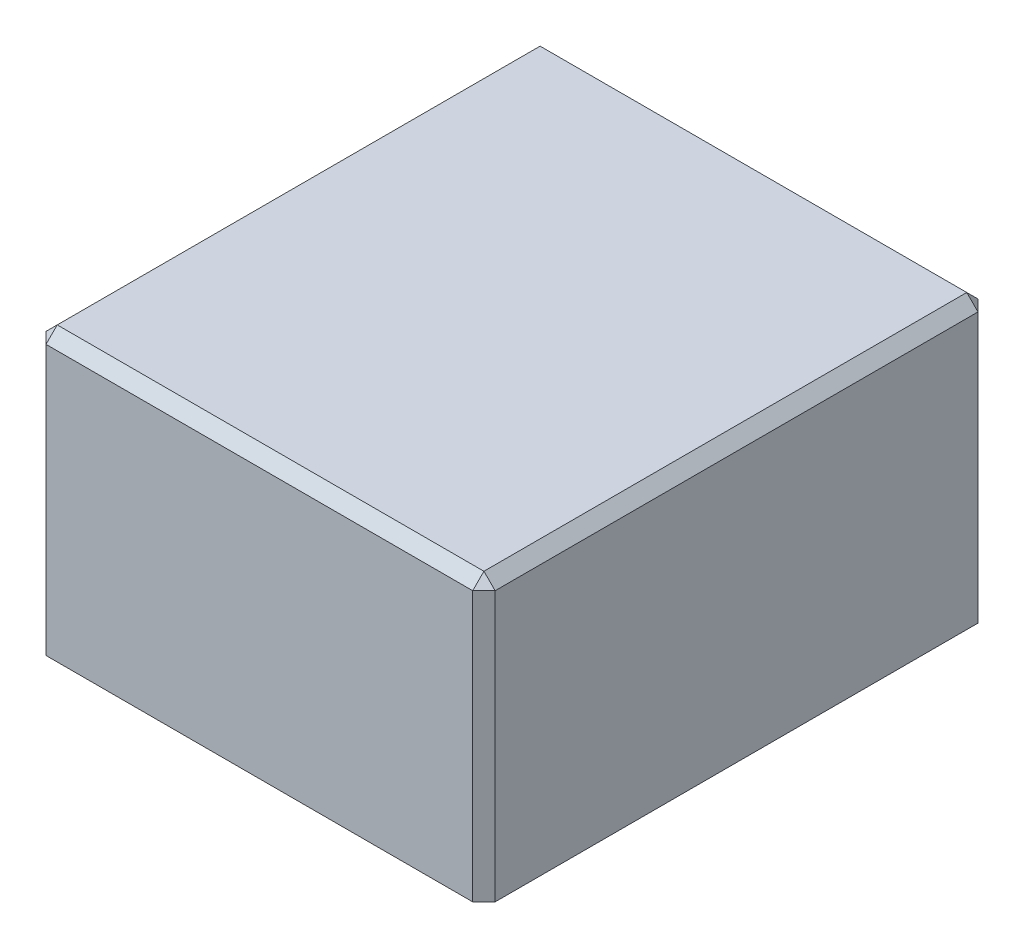
ISO-10303-21;
HEADER;
FILE_DESCRIPTION(('STEP AP214'),'2;1');
FILE_NAME('part.step','',(''),(''),'','','');
FILE_SCHEMA(('AUTOMOTIVE_DESIGN { 1 0 10303 214 1 1 1 1 }'));
ENDSEC;
DATA;
#1=APPLICATION_CONTEXT('core data for automotive mechanical design processes');
#2=APPLICATION_PROTOCOL_DEFINITION('international standard','automotive_design',2000,#1);
#3=PRODUCT_CONTEXT('',#1,'mechanical');
#4=PRODUCT('Part','Part','',(#3));
#5=PRODUCT_RELATED_PRODUCT_CATEGORY('part','',(#4));
#6=PRODUCT_DEFINITION_FORMATION('','',#4);
#7=PRODUCT_DEFINITION_CONTEXT('part definition',#1,'design');
#8=PRODUCT_DEFINITION('design','',#6,#7);
#9=PRODUCT_DEFINITION_SHAPE('','',#8);
#10=(LENGTH_UNIT() NAMED_UNIT(*) SI_UNIT(.MILLI.,.METRE.));
#11=(NAMED_UNIT(*) PLANE_ANGLE_UNIT() SI_UNIT($,.RADIAN.));
#12=(NAMED_UNIT(*) SI_UNIT($,.STERADIAN.) SOLID_ANGLE_UNIT());
#13=UNCERTAINTY_MEASURE_WITH_UNIT(LENGTH_MEASURE(1.E-05),#10,'distance_accuracy_value','');
#14=(GEOMETRIC_REPRESENTATION_CONTEXT(3) GLOBAL_UNCERTAINTY_ASSIGNED_CONTEXT((#13)) GLOBAL_UNIT_ASSIGNED_CONTEXT((#10,
#11,#12)) REPRESENTATION_CONTEXT('',''));
#15=CARTESIAN_POINT('',(0.,0.,0.));
#16=DIRECTION('',(0.,0.,1.));
#17=DIRECTION('',(1.,0.,0.));
#18=AXIS2_PLACEMENT_3D('',#15,#16,#17);
#19=CARTESIAN_POINT('',(0.,0.,0.));
#20=DIRECTION('',(0.,-1.,0.));
#21=DIRECTION('',(0.,0.,-1.));
#22=AXIS2_PLACEMENT_3D('',#19,#20,#21);
#23=PLANE('',#22);
#24=DIRECTION('',(-1.,0.,0.));
#25=VECTOR('',#24,1.);
#26=CARTESIAN_POINT('',(-2.,0.,-2.25));
#27=LINE('',#26,#25);
#28=CARTESIAN_POINT('',(1.9,0.,-2.25));
#29=VERTEX_POINT('',#28);
#30=CARTESIAN_POINT('',(-1.9,0.,-2.25));
#31=VERTEX_POINT('',#30);
#32=EDGE_CURVE('E196',#29,#31,#27,.T.);
#33=ORIENTED_EDGE('',*,*,#32,.F.);
#34=DIRECTION('',(-0.707106781186548,0.,-0.707106781186548));
#35=VECTOR('',#34,1.);
#36=CARTESIAN_POINT('',(2.075,0.,-2.075));
#37=LINE('',#36,#35);
#38=CARTESIAN_POINT('',(2.,0.,-2.15));
#39=VERTEX_POINT('',#38);
#40=EDGE_CURVE('E219',#29,#39,#37,.F.);
#41=ORIENTED_EDGE('',*,*,#40,.T.);
#42=DIRECTION('',(0.,0.,-1.));
#43=VECTOR('',#42,1.);
#44=CARTESIAN_POINT('',(2.,0.,2.25));
#45=LINE('',#44,#43);
#46=CARTESIAN_POINT('',(2.,0.,2.15));
#47=VERTEX_POINT('',#46);
#48=EDGE_CURVE('E192',#47,#39,#45,.T.);
#49=ORIENTED_EDGE('',*,*,#48,.F.);
#50=DIRECTION('',(0.707106781186548,0.,-0.707106781186548));
#51=VECTOR('',#50,1.);
#52=CARTESIAN_POINT('',(2.075,0.,2.075));
#53=LINE('',#52,#51);
#54=CARTESIAN_POINT('',(1.9,0.,2.25));
#55=VERTEX_POINT('',#54);
#56=EDGE_CURVE('E210',#47,#55,#53,.F.);
#57=ORIENTED_EDGE('',*,*,#56,.T.);
#58=DIRECTION('',(1.,0.,0.));
#59=VECTOR('',#58,1.);
#60=CARTESIAN_POINT('',(-2.,0.,2.25));
#61=LINE('',#60,#59);
#62=CARTESIAN_POINT('',(-1.9,0.,2.25));
#63=VERTEX_POINT('',#62);
#64=EDGE_CURVE('E183',#63,#55,#61,.T.);
#65=ORIENTED_EDGE('',*,*,#64,.F.);
#66=DIRECTION('',(0.707106781186548,0.,0.707106781186548));
#67=VECTOR('',#66,1.);
#68=CARTESIAN_POINT('',(-2.075,0.,2.075));
#69=LINE('',#68,#67);
#70=CARTESIAN_POINT('',(-2.,0.,2.15));
#71=VERTEX_POINT('',#70);
#72=EDGE_CURVE('E213',#63,#71,#69,.F.);
#73=ORIENTED_EDGE('',*,*,#72,.T.);
#74=DIRECTION('',(0.,0.,1.));
#75=VECTOR('',#74,1.);
#76=CARTESIAN_POINT('',(-2.,0.,2.25));
#77=LINE('',#76,#75);
#78=CARTESIAN_POINT('',(-2.,0.,-2.15));
#79=VERTEX_POINT('',#78);
#80=EDGE_CURVE('E177',#79,#71,#77,.T.);
#81=ORIENTED_EDGE('',*,*,#80,.F.);
#82=DIRECTION('',(-0.707106781186548,0.,0.707106781186548));
#83=VECTOR('',#82,1.);
#84=CARTESIAN_POINT('',(-2.075,0.,-2.075));
#85=LINE('',#84,#83);
#86=EDGE_CURVE('E216',#79,#31,#85,.F.);
#87=ORIENTED_EDGE('',*,*,#86,.T.);
#88=EDGE_LOOP('',(#33,#41,#49,#57,#65,#73,#81,#87));
#89=FACE_BOUND('',#88,.T.);
#90=DIRECTION('',(0.,0.,1.));
#91=VECTOR('',#90,1.);
#92=CARTESIAN_POINT('',(-1.6,0.,1.85));
#93=LINE('',#92,#91);
#94=CARTESIAN_POINT('',(-1.6,0.,-1.85));
#95=VERTEX_POINT('',#94);
#96=CARTESIAN_POINT('',(-1.6,0.,1.85));
#97=VERTEX_POINT('',#96);
#98=EDGE_CURVE('E171',#95,#97,#93,.T.);
#99=ORIENTED_EDGE('',*,*,#98,.T.);
#100=DIRECTION('',(1.,0.,0.));
#101=VECTOR('',#100,1.);
#102=CARTESIAN_POINT('',(-1.6,0.,1.85));
#103=LINE('',#102,#101);
#104=CARTESIAN_POINT('',(1.6,0.,1.85));
#105=VERTEX_POINT('',#104);
#106=EDGE_CURVE('E301',#97,#105,#103,.T.);
#107=ORIENTED_EDGE('',*,*,#106,.T.);
#108=DIRECTION('',(0.,0.,-1.));
#109=VECTOR('',#108,1.);
#110=CARTESIAN_POINT('',(1.6,0.,1.85));
#111=LINE('',#110,#109);
#112=CARTESIAN_POINT('',(1.6,0.,-1.85));
#113=VERTEX_POINT('',#112);
#114=EDGE_CURVE('E175',#105,#113,#111,.T.);
#115=ORIENTED_EDGE('',*,*,#114,.T.);
#116=DIRECTION('',(-1.,0.,0.));
#117=VECTOR('',#116,1.);
#118=CARTESIAN_POINT('',(-1.6,0.,-1.85));
#119=LINE('',#118,#117);
#120=EDGE_CURVE('E310',#113,#95,#119,.T.);
#121=ORIENTED_EDGE('',*,*,#120,.T.);
#122=EDGE_LOOP('',(#99,#107,#115,#121));
#123=FACE_BOUND('',#122,.T.);
#124=ADVANCED_FACE('F45',(#89,#123),#23,.T.);
#125=CARTESIAN_POINT('',(-2.,0.5,2.25));
#126=DIRECTION('',(1.,0.,0.));
#127=DIRECTION('',(0.,0.,-1.));
#128=AXIS2_PLACEMENT_3D('',#125,#126,#127);
#129=PLANE('',#128);
#130=DIRECTION('',(0.,0.,-1.));
#131=VECTOR('',#130,1.);
#132=CARTESIAN_POINT('',(-2.,2.4,-2.25));
#133=LINE('',#132,#131);
#134=CARTESIAN_POINT('',(-2.,2.4,2.15));
#135=VERTEX_POINT('',#134);
#136=CARTESIAN_POINT('',(-2.,2.4,-2.15));
#137=VERTEX_POINT('',#136);
#138=EDGE_CURVE('E231',#135,#137,#133,.T.);
#139=ORIENTED_EDGE('',*,*,#138,.T.);
#140=DIRECTION('',(0.,-1.,0.));
#141=VECTOR('',#140,1.);
#142=CARTESIAN_POINT('',(-2.,0.5,-2.15));
#143=LINE('',#142,#141);
#144=EDGE_CURVE('E237',#137,#79,#143,.T.);
#145=ORIENTED_EDGE('',*,*,#144,.T.);
#146=ORIENTED_EDGE('',*,*,#80,.T.);
#147=DIRECTION('',(0.,1.,0.));
#148=VECTOR('',#147,1.);
#149=CARTESIAN_POINT('',(-2.,0.5,2.15));
#150=LINE('',#149,#148);
#151=EDGE_CURVE('E234',#71,#135,#150,.T.);
#152=ORIENTED_EDGE('',*,*,#151,.T.);
#153=EDGE_LOOP('',(#139,#145,#146,#152));
#154=FACE_BOUND('',#153,.T.);
#155=ADVANCED_FACE('F331',(#154),#129,.F.);
#156=CARTESIAN_POINT('',(-2.,0.5,2.25));
#157=DIRECTION('',(0.,0.,-1.));
#158=DIRECTION('',(-1.,0.,0.));
#159=AXIS2_PLACEMENT_3D('',#156,#157,#158);
#160=PLANE('',#159);
#161=DIRECTION('',(-1.,0.,0.));
#162=VECTOR('',#161,1.);
#163=CARTESIAN_POINT('',(-2.,2.4,2.25));
#164=LINE('',#163,#162);
#165=CARTESIAN_POINT('',(1.9,2.4,2.25));
#166=VERTEX_POINT('',#165);
#167=CARTESIAN_POINT('',(-1.9,2.4,2.25));
#168=VERTEX_POINT('',#167);
#169=EDGE_CURVE('E243',#166,#168,#164,.T.);
#170=ORIENTED_EDGE('',*,*,#169,.T.);
#171=DIRECTION('',(0.,-1.,0.));
#172=VECTOR('',#171,1.);
#173=CARTESIAN_POINT('',(-1.9,0.5,2.25));
#174=LINE('',#173,#172);
#175=EDGE_CURVE('E246',#168,#63,#174,.T.);
#176=ORIENTED_EDGE('',*,*,#175,.T.);
#177=ORIENTED_EDGE('',*,*,#64,.T.);
#178=DIRECTION('',(0.,1.,0.));
#179=VECTOR('',#178,1.);
#180=CARTESIAN_POINT('',(1.9,0.5,2.25));
#181=LINE('',#180,#179);
#182=EDGE_CURVE('E240',#55,#166,#181,.T.);
#183=ORIENTED_EDGE('',*,*,#182,.T.);
#184=EDGE_LOOP('',(#170,#176,#177,#183));
#185=FACE_BOUND('',#184,.T.);
#186=ADVANCED_FACE('F337',(#185),#160,.F.);
#187=CARTESIAN_POINT('',(2.,0.5,2.25));
#188=DIRECTION('',(-1.,0.,0.));
#189=DIRECTION('',(0.,0.,1.));
#190=AXIS2_PLACEMENT_3D('',#187,#188,#189);
#191=PLANE('',#190);
#192=ORIENTED_EDGE('',*,*,#48,.T.);
#193=DIRECTION('',(0.,1.,0.));
#194=VECTOR('',#193,1.);
#195=CARTESIAN_POINT('',(2.,0.5,-2.15));
#196=LINE('',#195,#194);
#197=CARTESIAN_POINT('',(2.,2.4,-2.15));
#198=VERTEX_POINT('',#197);
#199=EDGE_CURVE('E228',#39,#198,#196,.T.);
#200=ORIENTED_EDGE('',*,*,#199,.T.);
#201=DIRECTION('',(0.,0.,1.));
#202=VECTOR('',#201,1.);
#203=CARTESIAN_POINT('',(2.,2.4,2.25));
#204=LINE('',#203,#202);
#205=CARTESIAN_POINT('',(2.,2.4,2.15));
#206=VERTEX_POINT('',#205);
#207=EDGE_CURVE('E225',#198,#206,#204,.T.);
#208=ORIENTED_EDGE('',*,*,#207,.T.);
#209=DIRECTION('',(0.,-1.,0.));
#210=VECTOR('',#209,1.);
#211=CARTESIAN_POINT('',(2.,0.5,2.15));
#212=LINE('',#211,#210);
#213=EDGE_CURVE('E222',#206,#47,#212,.T.);
#214=ORIENTED_EDGE('',*,*,#213,.T.);
#215=EDGE_LOOP('',(#192,#200,#208,#214));
#216=FACE_BOUND('',#215,.T.);
#217=ADVANCED_FACE('F347',(#216),#191,.F.);
#218=CARTESIAN_POINT('',(-2.,0.5,-2.25));
#219=DIRECTION('',(0.,0.,1.));
#220=DIRECTION('',(1.,0.,0.));
#221=AXIS2_PLACEMENT_3D('',#218,#219,#220);
#222=PLANE('',#221);
#223=DIRECTION('',(1.,0.,0.));
#224=VECTOR('',#223,1.);
#225=CARTESIAN_POINT('',(2.,2.4,-2.25));
#226=LINE('',#225,#224);
#227=CARTESIAN_POINT('',(-1.9,2.4,-2.25));
#228=VERTEX_POINT('',#227);
#229=CARTESIAN_POINT('',(1.9,2.4,-2.25));
#230=VERTEX_POINT('',#229);
#231=EDGE_CURVE('E200',#228,#230,#226,.T.);
#232=ORIENTED_EDGE('',*,*,#231,.T.);
#233=DIRECTION('',(0.,-1.,0.));
#234=VECTOR('',#233,1.);
#235=CARTESIAN_POINT('',(1.9,0.5,-2.25));
#236=LINE('',#235,#234);
#237=EDGE_CURVE('E206',#230,#29,#236,.T.);
#238=ORIENTED_EDGE('',*,*,#237,.T.);
#239=ORIENTED_EDGE('',*,*,#32,.T.);
#240=DIRECTION('',(0.,1.,0.));
#241=VECTOR('',#240,1.);
#242=CARTESIAN_POINT('',(-1.9,0.5,-2.25));
#243=LINE('',#242,#241);
#244=EDGE_CURVE('E203',#31,#228,#243,.T.);
#245=ORIENTED_EDGE('',*,*,#244,.T.);
#246=EDGE_LOOP('',(#232,#238,#239,#245));
#247=FACE_BOUND('',#246,.T.);
#248=ADVANCED_FACE('F344',(#247),#222,.F.);
#249=CARTESIAN_POINT('',(-1.6,0.5,1.85));
#250=DIRECTION('',(0.,0.,-1.));
#251=DIRECTION('',(-1.,0.,0.));
#252=AXIS2_PLACEMENT_3D('',#249,#250,#251);
#253=PLANE('',#252);
#254=ORIENTED_EDGE('',*,*,#106,.F.);
#255=DIRECTION('',(0.,-1.,0.));
#256=VECTOR('',#255,1.);
#257=CARTESIAN_POINT('',(-1.6,0.5,1.85));
#258=LINE('',#257,#256);
#259=CARTESIAN_POINT('',(-1.6,0.5,1.85));
#260=VERTEX_POINT('',#259);
#261=EDGE_CURVE('E169',#260,#97,#258,.T.);
#262=ORIENTED_EDGE('',*,*,#261,.F.);
#263=DIRECTION('',(1.,0.,0.));
#264=VECTOR('',#263,1.);
#265=CARTESIAN_POINT('',(-1.6,0.5,1.85));
#266=LINE('',#265,#264);
#267=CARTESIAN_POINT('',(1.6,0.5,1.85));
#268=VERTEX_POINT('',#267);
#269=EDGE_CURVE('E153',#260,#268,#266,.T.);
#270=ORIENTED_EDGE('',*,*,#269,.T.);
#271=DIRECTION('',(0.,-1.,0.));
#272=VECTOR('',#271,1.);
#273=CARTESIAN_POINT('',(1.6,0.5,1.85));
#274=LINE('',#273,#272);
#275=EDGE_CURVE('E166',#268,#105,#274,.T.);
#276=ORIENTED_EDGE('',*,*,#275,.T.);
#277=EDGE_LOOP('',(#254,#262,#270,#276));
#278=FACE_BOUND('',#277,.T.);
#279=ADVANCED_FACE('F165',(#278),#253,.T.);
#280=CARTESIAN_POINT('',(1.6,0.5,1.85));
#281=DIRECTION('',(-1.,0.,0.));
#282=DIRECTION('',(0.,0.,1.));
#283=AXIS2_PLACEMENT_3D('',#280,#281,#282);
#284=PLANE('',#283);
#285=ORIENTED_EDGE('',*,*,#114,.F.);
#286=ORIENTED_EDGE('',*,*,#275,.F.);
#287=DIRECTION('',(0.,0.,-1.));
#288=VECTOR('',#287,1.);
#289=CARTESIAN_POINT('',(1.6,0.5,1.85));
#290=LINE('',#289,#288);
#291=CARTESIAN_POINT('',(1.6,0.5,-1.85));
#292=VERTEX_POINT('',#291);
#293=EDGE_CURVE('E150',#268,#292,#290,.T.);
#294=ORIENTED_EDGE('',*,*,#293,.T.);
#295=DIRECTION('',(0.,-1.,0.));
#296=VECTOR('',#295,1.);
#297=CARTESIAN_POINT('',(1.6,0.5,-1.85));
#298=LINE('',#297,#296);
#299=EDGE_CURVE('E178',#292,#113,#298,.T.);
#300=ORIENTED_EDGE('',*,*,#299,.T.);
#301=EDGE_LOOP('',(#285,#286,#294,#300));
#302=FACE_BOUND('',#301,.T.);
#303=ADVANCED_FACE('F173',(#302),#284,.T.);
#304=CARTESIAN_POINT('',(-1.6,0.5,-1.85));
#305=DIRECTION('',(0.,0.,1.));
#306=DIRECTION('',(1.,0.,0.));
#307=AXIS2_PLACEMENT_3D('',#304,#305,#306);
#308=PLANE('',#307);
#309=ORIENTED_EDGE('',*,*,#120,.F.);
#310=ORIENTED_EDGE('',*,*,#299,.F.);
#311=DIRECTION('',(-1.,0.,0.));
#312=VECTOR('',#311,1.);
#313=CARTESIAN_POINT('',(-1.6,0.5,-1.85));
#314=LINE('',#313,#312);
#315=CARTESIAN_POINT('',(-1.6,0.5,-1.85));
#316=VERTEX_POINT('',#315);
#317=EDGE_CURVE('E156',#292,#316,#314,.T.);
#318=ORIENTED_EDGE('',*,*,#317,.T.);
#319=DIRECTION('',(0.,-1.,0.));
#320=VECTOR('',#319,1.);
#321=CARTESIAN_POINT('',(-1.6,0.5,-1.85));
#322=LINE('',#321,#320);
#323=EDGE_CURVE('E185',#316,#95,#322,.T.);
#324=ORIENTED_EDGE('',*,*,#323,.T.);
#325=EDGE_LOOP('',(#309,#310,#318,#324));
#326=FACE_BOUND('',#325,.T.);
#327=ADVANCED_FACE('F327',(#326),#308,.T.);
#328=CARTESIAN_POINT('',(-1.6,0.5,1.85));
#329=DIRECTION('',(1.,0.,0.));
#330=DIRECTION('',(0.,0.,-1.));
#331=AXIS2_PLACEMENT_3D('',#328,#329,#330);
#332=PLANE('',#331);
#333=ORIENTED_EDGE('',*,*,#98,.F.);
#334=ORIENTED_EDGE('',*,*,#323,.F.);
#335=DIRECTION('',(0.,0.,1.));
#336=VECTOR('',#335,1.);
#337=CARTESIAN_POINT('',(-1.6,0.5,1.85));
#338=LINE('',#337,#336);
#339=EDGE_CURVE('E313',#316,#260,#338,.T.);
#340=ORIENTED_EDGE('',*,*,#339,.T.);
#341=ORIENTED_EDGE('',*,*,#261,.T.);
#342=EDGE_LOOP('',(#333,#334,#340,#341));
#343=FACE_BOUND('',#342,.T.);
#344=ADVANCED_FACE('F329',(#343),#332,.T.);
#345=CARTESIAN_POINT('',(0.,0.5,0.));
#346=DIRECTION('',(0.,1.,0.));
#347=DIRECTION('',(0.,0.,1.));
#348=AXIS2_PLACEMENT_3D('',#345,#346,#347);
#349=PLANE('',#348);
#350=ORIENTED_EDGE('',*,*,#269,.F.);
#351=ORIENTED_EDGE('',*,*,#339,.F.);
#352=ORIENTED_EDGE('',*,*,#317,.F.);
#353=ORIENTED_EDGE('',*,*,#293,.F.);
#354=EDGE_LOOP('',(#350,#351,#352,#353));
#355=FACE_BOUND('',#354,.T.);
#356=ADVANCED_FACE('F152',(#355),#349,.F.);
#357=CARTESIAN_POINT('',(0.,2.5,0.));
#358=DIRECTION('',(0.,1.,0.));
#359=DIRECTION('',(0.,0.,1.));
#360=AXIS2_PLACEMENT_3D('',#357,#358,#359);
#361=PLANE('',#360);
#362=DIRECTION('',(0.,0.,-1.));
#363=VECTOR('',#362,1.);
#364=CARTESIAN_POINT('',(1.9,2.5,-2.25));
#365=LINE('',#364,#363);
#366=CARTESIAN_POINT('',(1.9,2.5,2.15));
#367=VERTEX_POINT('',#366);
#368=CARTESIAN_POINT('',(1.9,2.5,-2.15));
#369=VERTEX_POINT('',#368);
#370=EDGE_CURVE('E249',#367,#369,#365,.T.);
#371=ORIENTED_EDGE('',*,*,#370,.T.);
#372=DIRECTION('',(-1.,0.,0.));
#373=VECTOR('',#372,1.);
#374=CARTESIAN_POINT('',(-2.,2.5,-2.15));
#375=LINE('',#374,#373);
#376=CARTESIAN_POINT('',(-1.9,2.5,-2.15));
#377=VERTEX_POINT('',#376);
#378=EDGE_CURVE('E11',#369,#377,#375,.T.);
#379=ORIENTED_EDGE('',*,*,#378,.T.);
#380=DIRECTION('',(0.,0.,1.));
#381=VECTOR('',#380,1.);
#382=CARTESIAN_POINT('',(-1.9,2.5,2.25));
#383=LINE('',#382,#381);
#384=CARTESIAN_POINT('',(-1.9,2.5,2.15));
#385=VERTEX_POINT('',#384);
#386=EDGE_CURVE('E56',#377,#385,#383,.T.);
#387=ORIENTED_EDGE('',*,*,#386,.T.);
#388=DIRECTION('',(1.,0.,0.));
#389=VECTOR('',#388,1.);
#390=CARTESIAN_POINT('',(2.,2.5,2.15));
#391=LINE('',#390,#389);
#392=EDGE_CURVE('E252',#385,#367,#391,.T.);
#393=ORIENTED_EDGE('',*,*,#392,.T.);
#394=EDGE_LOOP('',(#371,#379,#387,#393));
#395=FACE_BOUND('',#394,.T.);
#396=ADVANCED_FACE('F430',(#395),#361,.T.);
#397=CARTESIAN_POINT('',(-1.9,0.5,2.25));
#398=DIRECTION('',(0.707106781186547,0.,-0.707106781186547));
#399=DIRECTION('',(0.,-1.,0.));
#400=AXIS2_PLACEMENT_3D('',#397,#398,#399);
#401=PLANE('',#400);
#402=DIRECTION('',(-0.707106781186547,0.,-0.707106781186547));
#403=VECTOR('',#402,1.);
#404=CARTESIAN_POINT('',(-2.,2.4,2.15));
#405=LINE('',#404,#403);
#406=EDGE_CURVE('E50',#135,#168,#405,.F.);
#407=ORIENTED_EDGE('',*,*,#406,.F.);
#408=ORIENTED_EDGE('',*,*,#151,.F.);
#409=ORIENTED_EDGE('',*,*,#72,.F.);
#410=ORIENTED_EDGE('',*,*,#175,.F.);
#411=EDGE_LOOP('',(#407,#408,#409,#410));
#412=FACE_BOUND('',#411,.T.);
#413=ADVANCED_FACE('F48',(#412),#401,.F.);
#414=CARTESIAN_POINT('',(-2.,2.4,2.15));
#415=DIRECTION('',(-0.577350269189626,0.577350269189626,0.577350269189626));
#416=DIRECTION('',(0.707106781186547,0.,0.707106781186547));
#417=AXIS2_PLACEMENT_3D('',#414,#415,#416);
#418=PLANE('',#417);
#419=DIRECTION('',(-0.707106781186547,-0.707106781186547,0.));
#420=VECTOR('',#419,1.);
#421=CARTESIAN_POINT('',(-2.,2.4,2.15));
#422=LINE('',#421,#420);
#423=EDGE_CURVE('E290',#135,#385,#422,.F.);
#424=ORIENTED_EDGE('',*,*,#423,.F.);
#425=ORIENTED_EDGE('',*,*,#406,.T.);
#426=DIRECTION('',(0.,0.707106781186547,-0.707106781186547));
#427=VECTOR('',#426,1.);
#428=CARTESIAN_POINT('',(-1.9,2.45,2.2));
#429=LINE('',#428,#427);
#430=EDGE_CURVE('E292',#385,#168,#429,.F.);
#431=ORIENTED_EDGE('',*,*,#430,.F.);
#432=EDGE_LOOP('',(#424,#425,#431));
#433=FACE_BOUND('',#432,.T.);
#434=ADVANCED_FACE('F422',(#433),#418,.T.);
#435=CARTESIAN_POINT('',(2.,0.5,2.15));
#436=DIRECTION('',(-0.707106781186547,0.,-0.707106781186547));
#437=DIRECTION('',(0.,-1.,0.));
#438=AXIS2_PLACEMENT_3D('',#435,#436,#437);
#439=PLANE('',#438);
#440=ORIENTED_EDGE('',*,*,#56,.F.);
#441=ORIENTED_EDGE('',*,*,#213,.F.);
#442=DIRECTION('',(-0.707106781186547,0.,0.707106781186547));
#443=VECTOR('',#442,1.);
#444=CARTESIAN_POINT('',(1.95,2.4,2.2));
#445=LINE('',#444,#443);
#446=EDGE_CURVE('E286',#166,#206,#445,.F.);
#447=ORIENTED_EDGE('',*,*,#446,.F.);
#448=ORIENTED_EDGE('',*,*,#182,.F.);
#449=EDGE_LOOP('',(#440,#441,#447,#448));
#450=FACE_BOUND('',#449,.T.);
#451=ADVANCED_FACE('F417',(#450),#439,.F.);
#452=CARTESIAN_POINT('',(0.,2.5,2.15));
#453=DIRECTION('',(0.,0.707106781186547,0.707106781186547));
#454=DIRECTION('',(-1.,0.,0.));
#455=AXIS2_PLACEMENT_3D('',#452,#453,#454);
#456=PLANE('',#455);
#457=ORIENTED_EDGE('',*,*,#430,.T.);
#458=ORIENTED_EDGE('',*,*,#169,.F.);
#459=DIRECTION('',(0.,-0.707106781186547,0.707106781186547));
#460=VECTOR('',#459,1.);
#461=CARTESIAN_POINT('',(1.9,2.5,2.15));
#462=LINE('',#461,#460);
#463=EDGE_CURVE('E282',#367,#166,#462,.T.);
#464=ORIENTED_EDGE('',*,*,#463,.F.);
#465=ORIENTED_EDGE('',*,*,#392,.F.);
#466=EDGE_LOOP('',(#457,#458,#464,#465));
#467=FACE_BOUND('',#466,.T.);
#468=ADVANCED_FACE('F410',(#467),#456,.T.);
#469=CARTESIAN_POINT('',(-1.9,2.5,0.));
#470=DIRECTION('',(-0.707106781186547,0.707106781186547,0.));
#471=DIRECTION('',(0.,0.,-1.));
#472=AXIS2_PLACEMENT_3D('',#469,#470,#471);
#473=PLANE('',#472);
#474=ORIENTED_EDGE('',*,*,#423,.T.);
#475=ORIENTED_EDGE('',*,*,#386,.F.);
#476=DIRECTION('',(0.707106781186547,0.707106781186547,0.));
#477=VECTOR('',#476,1.);
#478=CARTESIAN_POINT('',(-1.95,2.45,-2.15));
#479=LINE('',#478,#477);
#480=EDGE_CURVE('E279',#137,#377,#479,.T.);
#481=ORIENTED_EDGE('',*,*,#480,.F.);
#482=ORIENTED_EDGE('',*,*,#138,.F.);
#483=EDGE_LOOP('',(#474,#475,#481,#482));
#484=FACE_BOUND('',#483,.T.);
#485=ADVANCED_FACE('F403',(#484),#473,.T.);
#486=CARTESIAN_POINT('',(-2.,0.5,-2.15));
#487=DIRECTION('',(0.707106781186547,0.,0.707106781186547));
#488=DIRECTION('',(0.,-1.,0.));
#489=AXIS2_PLACEMENT_3D('',#486,#487,#488);
#490=PLANE('',#489);
#491=ORIENTED_EDGE('',*,*,#86,.F.);
#492=ORIENTED_EDGE('',*,*,#144,.F.);
#493=DIRECTION('',(0.707106781186547,0.,-0.707106781186547));
#494=VECTOR('',#493,1.);
#495=CARTESIAN_POINT('',(-1.9,2.4,-2.25));
#496=LINE('',#495,#494);
#497=EDGE_CURVE('E275',#228,#137,#496,.F.);
#498=ORIENTED_EDGE('',*,*,#497,.F.);
#499=ORIENTED_EDGE('',*,*,#244,.F.);
#500=EDGE_LOOP('',(#491,#492,#498,#499));
#501=FACE_BOUND('',#500,.T.);
#502=ADVANCED_FACE('F396',(#501),#490,.F.);
#503=CARTESIAN_POINT('',(1.9,2.5,2.15));
#504=DIRECTION('',(0.577350269189626,0.577350269189626,0.577350269189626));
#505=DIRECTION('',(0.707106781186547,0.,-0.707106781186547));
#506=AXIS2_PLACEMENT_3D('',#503,#504,#505);
#507=PLANE('',#506);
#508=ORIENTED_EDGE('',*,*,#463,.T.);
#509=ORIENTED_EDGE('',*,*,#446,.T.);
#510=DIRECTION('',(-0.707106781186547,0.707106781186547,0.));
#511=VECTOR('',#510,1.);
#512=CARTESIAN_POINT('',(1.9,2.5,2.15));
#513=LINE('',#512,#511);
#514=EDGE_CURVE('E271',#367,#206,#513,.F.);
#515=ORIENTED_EDGE('',*,*,#514,.F.);
#516=EDGE_LOOP('',(#508,#509,#515));
#517=FACE_BOUND('',#516,.T.);
#518=ADVANCED_FACE('F389',(#517),#507,.T.);
#519=CARTESIAN_POINT('',(-1.9,2.4,-2.25));
#520=DIRECTION('',(-0.577350269189626,0.577350269189626,-0.577350269189626));
#521=DIRECTION('',(-0.707106781186547,0.,0.707106781186547));
#522=AXIS2_PLACEMENT_3D('',#519,#520,#521);
#523=PLANE('',#522);
#524=ORIENTED_EDGE('',*,*,#497,.T.);
#525=ORIENTED_EDGE('',*,*,#480,.T.);
#526=DIRECTION('',(0.,-0.707106781186547,-0.707106781186547));
#527=VECTOR('',#526,1.);
#528=CARTESIAN_POINT('',(-1.9,2.4,-2.25));
#529=LINE('',#528,#527);
#530=EDGE_CURVE('E64',#228,#377,#529,.F.);
#531=ORIENTED_EDGE('',*,*,#530,.F.);
#532=EDGE_LOOP('',(#524,#525,#531));
#533=FACE_BOUND('',#532,.T.);
#534=ADVANCED_FACE('F382',(#533),#523,.T.);
#535=CARTESIAN_POINT('',(1.9,2.5,0.));
#536=DIRECTION('',(0.707106781186547,0.707106781186547,0.));
#537=DIRECTION('',(0.,0.,1.));
#538=AXIS2_PLACEMENT_3D('',#535,#536,#537);
#539=PLANE('',#538);
#540=ORIENTED_EDGE('',*,*,#514,.T.);
#541=ORIENTED_EDGE('',*,*,#207,.F.);
#542=DIRECTION('',(0.707106781186547,-0.707106781186547,0.));
#543=VECTOR('',#542,1.);
#544=CARTESIAN_POINT('',(2.,2.4,-2.15));
#545=LINE('',#544,#543);
#546=EDGE_CURVE('E265',#369,#198,#545,.T.);
#547=ORIENTED_EDGE('',*,*,#546,.F.);
#548=ORIENTED_EDGE('',*,*,#370,.F.);
#549=EDGE_LOOP('',(#540,#541,#547,#548));
#550=FACE_BOUND('',#549,.T.);
#551=ADVANCED_FACE('F376',(#550),#539,.T.);
#552=CARTESIAN_POINT('',(0.,2.5,-2.15));
#553=DIRECTION('',(0.,0.707106781186547,-0.707106781186547));
#554=DIRECTION('',(1.,0.,0.));
#555=AXIS2_PLACEMENT_3D('',#552,#553,#554);
#556=PLANE('',#555);
#557=ORIENTED_EDGE('',*,*,#530,.T.);
#558=ORIENTED_EDGE('',*,*,#378,.F.);
#559=DIRECTION('',(0.,0.707106781186547,0.707106781186547));
#560=VECTOR('',#559,1.);
#561=CARTESIAN_POINT('',(1.9,2.45,-2.2));
#562=LINE('',#561,#560);
#563=EDGE_CURVE('E261',#230,#369,#562,.T.);
#564=ORIENTED_EDGE('',*,*,#563,.F.);
#565=ORIENTED_EDGE('',*,*,#231,.F.);
#566=EDGE_LOOP('',(#557,#558,#564,#565));
#567=FACE_BOUND('',#566,.T.);
#568=ADVANCED_FACE('F369',(#567),#556,.T.);
#569=CARTESIAN_POINT('',(2.,2.4,-2.15));
#570=DIRECTION('',(0.577350269189626,0.577350269189626,-0.577350269189626));
#571=DIRECTION('',(-0.707106781186547,0.,-0.707106781186547));
#572=AXIS2_PLACEMENT_3D('',#569,#570,#571);
#573=PLANE('',#572);
#574=ORIENTED_EDGE('',*,*,#563,.T.);
#575=ORIENTED_EDGE('',*,*,#546,.T.);
#576=DIRECTION('',(0.707106781186547,0.,0.707106781186547));
#577=VECTOR('',#576,1.);
#578=CARTESIAN_POINT('',(2.,2.4,-2.15));
#579=LINE('',#578,#577);
#580=EDGE_CURVE('E257',#230,#198,#579,.T.);
#581=ORIENTED_EDGE('',*,*,#580,.F.);
#582=EDGE_LOOP('',(#574,#575,#581));
#583=FACE_BOUND('',#582,.T.);
#584=ADVANCED_FACE('F362',(#583),#573,.T.);
#585=CARTESIAN_POINT('',(1.9,0.5,-2.25));
#586=DIRECTION('',(-0.707106781186547,0.,0.707106781186547));
#587=DIRECTION('',(0.,-1.,0.));
#588=AXIS2_PLACEMENT_3D('',#585,#586,#587);
#589=PLANE('',#588);
#590=ORIENTED_EDGE('',*,*,#580,.T.);
#591=ORIENTED_EDGE('',*,*,#199,.F.);
#592=ORIENTED_EDGE('',*,*,#40,.F.);
#593=ORIENTED_EDGE('',*,*,#237,.F.);
#594=EDGE_LOOP('',(#590,#591,#592,#593));
#595=FACE_BOUND('',#594,.T.);
#596=ADVANCED_FACE('F356',(#595),#589,.F.);
#597=CLOSED_SHELL('',(#124,#155,#186,#217,#248,#279,#303,#327,#344,#356,#396,#413,#434,#451,
#468,#485,#502,#518,#534,#551,#568,#584,#596));
#598=MANIFOLD_SOLID_BREP('B2',#597);
#599=ADVANCED_BREP_SHAPE_REPRESENTATION('',(#18,#598),#14);
#600=SHAPE_DEFINITION_REPRESENTATION(#9,#599);
ENDSEC;
END-ISO-10303-21;
